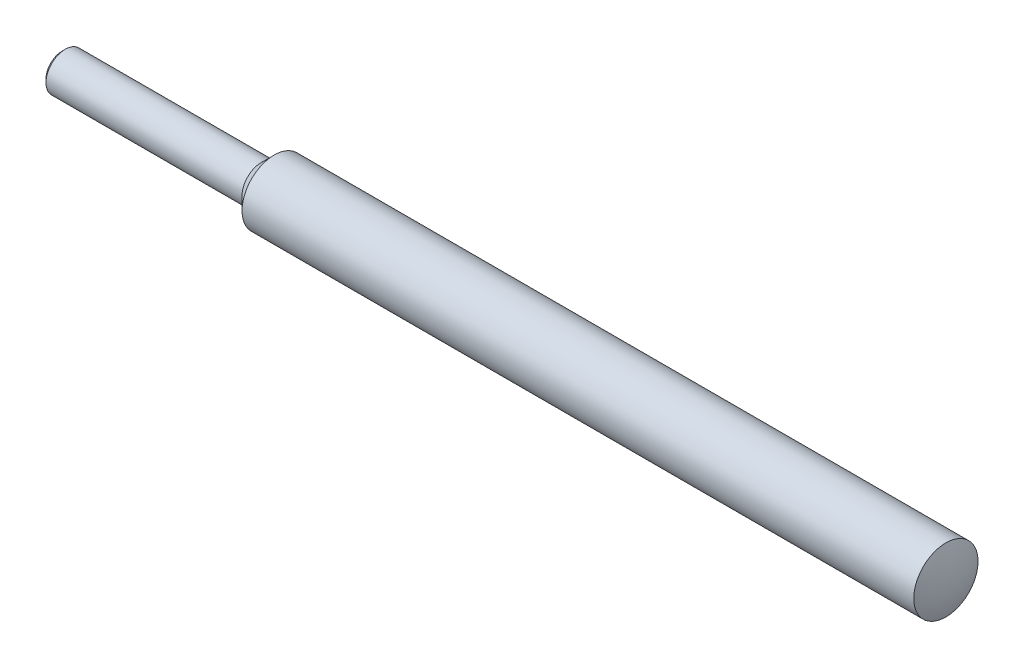
ISO-10303-21;
HEADER;
FILE_DESCRIPTION(('STEP AP214'),'2;1');
FILE_NAME('part.step','',(''),(''),'','','');
FILE_SCHEMA(('AUTOMOTIVE_DESIGN { 1 0 10303 214 1 1 1 1 }'));
ENDSEC;
DATA;
#1=APPLICATION_CONTEXT('core data for automotive mechanical design processes');
#2=APPLICATION_PROTOCOL_DEFINITION('international standard','automotive_design',2000,#1);
#3=PRODUCT_CONTEXT('',#1,'mechanical');
#4=PRODUCT('Part','Part','',(#3));
#5=PRODUCT_RELATED_PRODUCT_CATEGORY('part','',(#4));
#6=PRODUCT_DEFINITION_FORMATION('','',#4);
#7=PRODUCT_DEFINITION_CONTEXT('part definition',#1,'design');
#8=PRODUCT_DEFINITION('design','',#6,#7);
#9=PRODUCT_DEFINITION_SHAPE('','',#8);
#10=(LENGTH_UNIT() NAMED_UNIT(*) SI_UNIT(.MILLI.,.METRE.));
#11=(NAMED_UNIT(*) PLANE_ANGLE_UNIT() SI_UNIT($,.RADIAN.));
#12=(NAMED_UNIT(*) SI_UNIT($,.STERADIAN.) SOLID_ANGLE_UNIT());
#13=UNCERTAINTY_MEASURE_WITH_UNIT(LENGTH_MEASURE(1.E-05),#10,'distance_accuracy_value','');
#14=(GEOMETRIC_REPRESENTATION_CONTEXT(3) GLOBAL_UNCERTAINTY_ASSIGNED_CONTEXT((#13)) GLOBAL_UNIT_ASSIGNED_CONTEXT((#10,
#11,#12)) REPRESENTATION_CONTEXT('',''));
#15=CARTESIAN_POINT('',(0.,0.,0.));
#16=DIRECTION('',(0.,0.,1.));
#17=DIRECTION('',(1.,0.,0.));
#18=AXIS2_PLACEMENT_3D('',#15,#16,#17);
#19=CARTESIAN_POINT('',(0.,0.,0.));
#20=DIRECTION('',(1.,0.,0.));
#21=DIRECTION('',(0.,0.,-1.));
#22=AXIS2_PLACEMENT_3D('',#19,#20,#21);
#23=PLANE('',#22);
#24=CARTESIAN_POINT('',(0.,0.,0.));
#25=DIRECTION('',(1.,0.,0.));
#26=DIRECTION('',(0.,0.,-1.));
#27=AXIS2_PLACEMENT_3D('',#24,#25,#26);
#28=CIRCLE('',#27,4.99999999999995);
#29=CARTESIAN_POINT('',(0.,0.,-4.99999999999995));
#30=VERTEX_POINT('',#29);
#31=EDGE_CURVE('E47',#30,#30,#28,.F.);
#32=ORIENTED_EDGE('',*,*,#31,.T.);
#33=EDGE_LOOP('',(#32));
#34=FACE_BOUND('',#33,.T.);
#35=ADVANCED_FACE('F39',(#34),#23,.F.);
#36=CARTESIAN_POINT('',(251.,0.,0.));
#37=DIRECTION('',(-1.,0.,0.));
#38=DIRECTION('',(0.,1.,0.));
#39=AXIS2_PLACEMENT_3D('',#36,#37,#38);
#40=SPHERICAL_SURFACE('',#39,26.);
#41=CARTESIAN_POINT('',(275.,0.,0.));
#42=DIRECTION('',(-1.,0.,0.));
#43=DIRECTION('',(0.,0.,1.));
#44=AXIS2_PLACEMENT_3D('',#41,#42,#43);
#45=CIRCLE('',#44,10.);
#46=CARTESIAN_POINT('',(275.,0.,10.));
#47=VERTEX_POINT('',#46);
#48=EDGE_CURVE('E51',#47,#47,#45,.T.);
#49=ORIENTED_EDGE('',*,*,#48,.F.);
#50=EDGE_LOOP('',(#49));
#51=FACE_BOUND('',#50,.T.);
#52=ADVANCED_FACE('F77',(#51),#40,.T.);
#53=CARTESIAN_POINT('',(0.,0.,0.));
#54=DIRECTION('',(-1.,0.,0.));
#55=DIRECTION('',(0.,0.,1.));
#56=AXIS2_PLACEMENT_3D('',#53,#54,#55);
#57=CYLINDRICAL_SURFACE('',#56,10.);
#58=ORIENTED_EDGE('',*,*,#48,.T.);
#59=EDGE_LOOP('',(#58));
#60=FACE_BOUND('',#59,.T.);
#61=CARTESIAN_POINT('',(66.,0.,0.));
#62=DIRECTION('',(-1.,0.,0.));
#63=DIRECTION('',(0.,0.,1.));
#64=AXIS2_PLACEMENT_3D('',#61,#62,#63);
#65=CIRCLE('',#64,9.99999999999999);
#66=CARTESIAN_POINT('',(66.,0.,9.99999999999999));
#67=VERTEX_POINT('',#66);
#68=EDGE_CURVE('E55',#67,#67,#65,.T.);
#69=ORIENTED_EDGE('',*,*,#68,.F.);
#70=EDGE_LOOP('',(#69));
#71=FACE_BOUND('',#70,.T.);
#72=ADVANCED_FACE('F68',(#60,#71),#57,.T.);
#73=CARTESIAN_POINT('',(62.,0.,0.));
#74=DIRECTION('',(1.,0.,0.));
#75=DIRECTION('',(0.,0.,-1.));
#76=AXIS2_PLACEMENT_3D('',#73,#74,#75);
#77=CONICAL_SURFACE('',#76,6.,0.785398163397449);
#78=ORIENTED_EDGE('',*,*,#68,.T.);
#79=EDGE_LOOP('',(#78));
#80=FACE_BOUND('',#79,.T.);
#81=CARTESIAN_POINT('',(62.,0.,0.));
#82=DIRECTION('',(-1.,0.,0.));
#83=DIRECTION('',(0.,0.,1.));
#84=AXIS2_PLACEMENT_3D('',#81,#82,#83);
#85=CIRCLE('',#84,6.);
#86=CARTESIAN_POINT('',(62.,0.,6.));
#87=VERTEX_POINT('',#86);
#88=EDGE_CURVE('E60',#87,#87,#85,.T.);
#89=ORIENTED_EDGE('',*,*,#88,.F.);
#90=EDGE_LOOP('',(#89));
#91=FACE_BOUND('',#90,.T.);
#92=ADVANCED_FACE('F66',(#80,#91),#77,.T.);
#93=CARTESIAN_POINT('',(0.,0.,0.));
#94=DIRECTION('',(-1.,0.,0.));
#95=DIRECTION('',(0.,0.,1.));
#96=AXIS2_PLACEMENT_3D('',#93,#94,#95);
#97=CYLINDRICAL_SURFACE('',#96,6.);
#98=CARTESIAN_POINT('',(1.00000000000002,0.,0.));
#99=DIRECTION('',(1.,0.,0.));
#100=DIRECTION('',(0.,0.,-1.));
#101=AXIS2_PLACEMENT_3D('',#98,#99,#100);
#102=CIRCLE('',#101,6.);
#103=CARTESIAN_POINT('',(1.00000000000002,0.,-6.));
#104=VERTEX_POINT('',#103);
#105=EDGE_CURVE('E10',#104,#104,#102,.T.);
#106=ORIENTED_EDGE('',*,*,#105,.T.);
#107=EDGE_LOOP('',(#106));
#108=FACE_BOUND('',#107,.T.);
#109=ORIENTED_EDGE('',*,*,#88,.T.);
#110=EDGE_LOOP('',(#109));
#111=FACE_BOUND('',#110,.T.);
#112=ADVANCED_FACE('F64',(#108,#111),#97,.T.);
#113=CARTESIAN_POINT('',(0.,0.,0.));
#114=DIRECTION('',(1.,0.,0.));
#115=DIRECTION('',(0.,0.,-1.));
#116=AXIS2_PLACEMENT_3D('',#113,#114,#115);
#117=CONICAL_SURFACE('',#116,4.99999999999995,0.785398163397466);
#118=ORIENTED_EDGE('',*,*,#105,.F.);
#119=EDGE_LOOP('',(#118));
#120=FACE_BOUND('',#119,.T.);
#121=ORIENTED_EDGE('',*,*,#31,.F.);
#122=EDGE_LOOP('',(#121));
#123=FACE_BOUND('',#122,.T.);
#124=ADVANCED_FACE('F42',(#120,#123),#117,.T.);
#125=CLOSED_SHELL('',(#35,#52,#72,#92,#112,#124));
#126=MANIFOLD_SOLID_BREP('B2',#125);
#127=ADVANCED_BREP_SHAPE_REPRESENTATION('',(#18,#126),#14);
#128=SHAPE_DEFINITION_REPRESENTATION(#9,#127);
ENDSEC;
END-ISO-10303-21;
